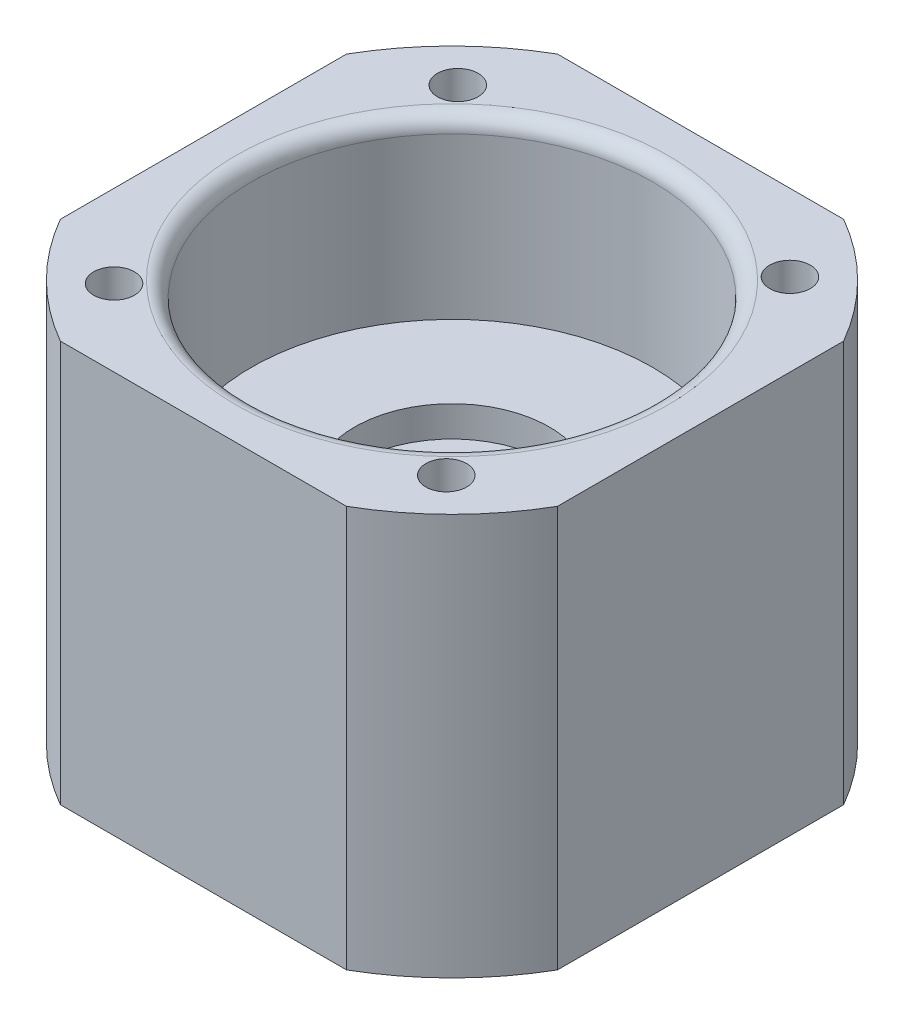
ISO-10303-21;
HEADER;
FILE_DESCRIPTION(('STEP AP214'),'2;1');
FILE_NAME('part.step','',(''),(''),'','','');
FILE_SCHEMA(('AUTOMOTIVE_DESIGN { 1 0 10303 214 1 1 1 1 }'));
ENDSEC;
DATA;
#1=APPLICATION_CONTEXT('core data for automotive mechanical design processes');
#2=APPLICATION_PROTOCOL_DEFINITION('international standard','automotive_design',2000,#1);
#3=PRODUCT_CONTEXT('',#1,'mechanical');
#4=PRODUCT('Part','Part','',(#3));
#5=PRODUCT_RELATED_PRODUCT_CATEGORY('part','',(#4));
#6=PRODUCT_DEFINITION_FORMATION('','',#4);
#7=PRODUCT_DEFINITION_CONTEXT('part definition',#1,'design');
#8=PRODUCT_DEFINITION('design','',#6,#7);
#9=PRODUCT_DEFINITION_SHAPE('','',#8);
#10=(LENGTH_UNIT() NAMED_UNIT(*) SI_UNIT(.MILLI.,.METRE.));
#11=(NAMED_UNIT(*) PLANE_ANGLE_UNIT() SI_UNIT($,.RADIAN.));
#12=(NAMED_UNIT(*) SI_UNIT($,.STERADIAN.) SOLID_ANGLE_UNIT());
#13=UNCERTAINTY_MEASURE_WITH_UNIT(LENGTH_MEASURE(1.E-05),#10,'distance_accuracy_value','');
#14=(GEOMETRIC_REPRESENTATION_CONTEXT(3) GLOBAL_UNCERTAINTY_ASSIGNED_CONTEXT((#13)) GLOBAL_UNIT_ASSIGNED_CONTEXT((#10,
#11,#12)) REPRESENTATION_CONTEXT('',''));
#15=CARTESIAN_POINT('',(0.,0.,0.));
#16=DIRECTION('',(0.,0.,1.));
#17=DIRECTION('',(1.,0.,0.));
#18=AXIS2_PLACEMENT_3D('',#15,#16,#17);
#19=CARTESIAN_POINT('',(-13.335,26.67,0.));
#20=DIRECTION('',(0.,1.,0.));
#21=DIRECTION('',(0.,0.,1.));
#22=AXIS2_PLACEMENT_3D('',#19,#20,#21);
#23=PLANE('',#22);
#24=CARTESIAN_POINT('',(0.,26.67,0.));
#25=DIRECTION('',(0.,1.,0.));
#26=DIRECTION('',(0.,0.,1.));
#27=AXIS2_PLACEMENT_3D('',#24,#25,#26);
#28=CIRCLE('',#27,14.351);
#29=CARTESIAN_POINT('',(0.,26.67,14.351));
#30=VERTEX_POINT('',#29);
#31=EDGE_CURVE('E12',#30,#30,#28,.F.);
#32=ORIENTED_EDGE('',*,*,#31,.T.);
#33=EDGE_LOOP('',(#32));
#34=FACE_BOUND('',#33,.T.);
#35=CARTESIAN_POINT('',(11.0325672343683,26.67,-11.414818667817));
#36=DIRECTION('',(0.,1.,0.));
#37=DIRECTION('',(0.,0.,1.));
#38=AXIS2_PLACEMENT_3D('',#35,#36,#37);
#39=CIRCLE('',#38,1.35254999999999);
#40=CARTESIAN_POINT('',(11.0325672343683,26.67,-10.062268667817));
#41=VERTEX_POINT('',#40);
#42=EDGE_CURVE('E226',#41,#41,#39,.T.);
#43=ORIENTED_EDGE('',*,*,#42,.F.);
#44=EDGE_LOOP('',(#43));
#45=FACE_BOUND('',#44,.T.);
#46=CARTESIAN_POINT('',(11.0325672343683,26.67,11.414818667817));
#47=DIRECTION('',(0.,1.,0.));
#48=DIRECTION('',(0.,0.,1.));
#49=AXIS2_PLACEMENT_3D('',#46,#47,#48);
#50=CIRCLE('',#49,1.35254999999999);
#51=CARTESIAN_POINT('',(11.0325672343683,26.67,12.767368667817));
#52=VERTEX_POINT('',#51);
#53=EDGE_CURVE('E225',#52,#52,#50,.T.);
#54=ORIENTED_EDGE('',*,*,#53,.F.);
#55=EDGE_LOOP('',(#54));
#56=FACE_BOUND('',#55,.T.);
#57=CARTESIAN_POINT('',(-11.0325672343683,26.67,11.414818667817));
#58=DIRECTION('',(0.,1.,0.));
#59=DIRECTION('',(0.,0.,1.));
#60=AXIS2_PLACEMENT_3D('',#57,#58,#59);
#61=CIRCLE('',#60,1.35254999999999);
#62=CARTESIAN_POINT('',(-11.0325672343683,26.67,12.767368667817));
#63=VERTEX_POINT('',#62);
#64=EDGE_CURVE('E216',#63,#63,#61,.T.);
#65=ORIENTED_EDGE('',*,*,#64,.F.);
#66=EDGE_LOOP('',(#65));
#67=FACE_BOUND('',#66,.T.);
#68=CARTESIAN_POINT('',(-11.0325672343683,26.67,-11.414818667817));
#69=DIRECTION('',(0.,1.,0.));
#70=DIRECTION('',(0.,0.,1.));
#71=AXIS2_PLACEMENT_3D('',#68,#69,#70);
#72=CIRCLE('',#71,1.35254999999999);
#73=CARTESIAN_POINT('',(-11.0325672343683,26.67,-10.062268667817));
#74=VERTEX_POINT('',#73);
#75=EDGE_CURVE('E209',#74,#74,#72,.T.);
#76=ORIENTED_EDGE('',*,*,#75,.F.);
#77=EDGE_LOOP('',(#76));
#78=FACE_BOUND('',#77,.T.);
#79=CARTESIAN_POINT('',(0.,26.67,0.));
#80=DIRECTION('',(0.,1.,0.));
#81=DIRECTION('',(0.,0.,1.));
#82=AXIS2_PLACEMENT_3D('',#79,#80,#81);
#83=CIRCLE('',#82,19.05);
#84=CARTESIAN_POINT('',(16.51,26.67,-9.50380976240582));
#85=VERTEX_POINT('',#84);
#86=CARTESIAN_POINT('',(9.50380976240582,26.67,-16.51));
#87=VERTEX_POINT('',#86);
#88=EDGE_CURVE('E107',#85,#87,#83,.T.);
#89=ORIENTED_EDGE('',*,*,#88,.T.);
#90=DIRECTION('',(1.,0.,0.));
#91=VECTOR('',#90,1.);
#92=CARTESIAN_POINT('',(-13.335,26.67,-16.51));
#93=LINE('',#92,#91);
#94=CARTESIAN_POINT('',(-9.50380976240582,26.67,-16.51));
#95=VERTEX_POINT('',#94);
#96=EDGE_CURVE('E87',#87,#95,#93,.F.);
#97=ORIENTED_EDGE('',*,*,#96,.T.);
#98=CARTESIAN_POINT('',(-16.51,26.67,-9.50380976240582));
#99=VERTEX_POINT('',#98);
#100=EDGE_CURVE('E113',#95,#99,#83,.T.);
#101=ORIENTED_EDGE('',*,*,#100,.T.);
#102=DIRECTION('',(0.,0.,1.));
#103=VECTOR('',#102,1.);
#104=CARTESIAN_POINT('',(-16.51,26.67,0.));
#105=LINE('',#104,#103);
#106=CARTESIAN_POINT('',(-16.51,26.67,9.50380976240582));
#107=VERTEX_POINT('',#106);
#108=EDGE_CURVE('E99',#99,#107,#105,.T.);
#109=ORIENTED_EDGE('',*,*,#108,.T.);
#110=CARTESIAN_POINT('',(-9.50380976240582,26.67,16.51));
#111=VERTEX_POINT('',#110);
#112=EDGE_CURVE('E116',#107,#111,#83,.T.);
#113=ORIENTED_EDGE('',*,*,#112,.T.);
#114=DIRECTION('',(1.,0.,0.));
#115=VECTOR('',#114,1.);
#116=CARTESIAN_POINT('',(-13.335,26.67,16.51));
#117=LINE('',#116,#115);
#118=CARTESIAN_POINT('',(9.50380976240582,26.67,16.51));
#119=VERTEX_POINT('',#118);
#120=EDGE_CURVE('E65',#111,#119,#117,.T.);
#121=ORIENTED_EDGE('',*,*,#120,.T.);
#122=CARTESIAN_POINT('',(16.51,26.67,9.50380976240582));
#123=VERTEX_POINT('',#122);
#124=EDGE_CURVE('E111',#119,#123,#83,.T.);
#125=ORIENTED_EDGE('',*,*,#124,.T.);
#126=DIRECTION('',(0.,0.,1.));
#127=VECTOR('',#126,1.);
#128=CARTESIAN_POINT('',(16.51,26.67,0.));
#129=LINE('',#128,#127);
#130=EDGE_CURVE('E101',#123,#85,#129,.F.);
#131=ORIENTED_EDGE('',*,*,#130,.T.);
#132=EDGE_LOOP('',(#89,#97,#101,#109,#113,#121,#125,#131));
#133=FACE_BOUND('',#132,.T.);
#134=ADVANCED_FACE('F44',(#34,#45,#56,#67,#78,#133),#23,.T.);
#135=CARTESIAN_POINT('',(0.,11.1358290356769,0.));
#136=DIRECTION('',(0.,1.,0.));
#137=DIRECTION('',(0.,0.,1.));
#138=AXIS2_PLACEMENT_3D('',#135,#136,#137);
#139=CYLINDRICAL_SURFACE('',#138,19.05);
#140=ORIENTED_EDGE('',*,*,#88,.F.);
#141=DIRECTION('',(0.,1.,0.));
#142=VECTOR('',#141,1.);
#143=CARTESIAN_POINT('',(16.51,11.1358290356769,-9.50380976240582));
#144=LINE('',#143,#142);
#145=CARTESIAN_POINT('',(16.51,0.,-9.50380976240581));
#146=VERTEX_POINT('',#145);
#147=EDGE_CURVE('E160',#85,#146,#144,.F.);
#148=ORIENTED_EDGE('',*,*,#147,.T.);
#149=CARTESIAN_POINT('',(0.,0.,0.));
#150=DIRECTION('',(0.,1.,0.));
#151=DIRECTION('',(0.,0.,1.));
#152=AXIS2_PLACEMENT_3D('',#149,#150,#151);
#153=CIRCLE('',#152,19.05);
#154=CARTESIAN_POINT('',(9.50380976240581,0.,-16.51));
#155=VERTEX_POINT('',#154);
#156=EDGE_CURVE('E109',#146,#155,#153,.T.);
#157=ORIENTED_EDGE('',*,*,#156,.T.);
#158=DIRECTION('',(0.,1.,0.));
#159=VECTOR('',#158,1.);
#160=CARTESIAN_POINT('',(9.50380976240582,11.1358290356769,-16.51));
#161=LINE('',#160,#159);
#162=EDGE_CURVE('E95',#155,#87,#161,.T.);
#163=ORIENTED_EDGE('',*,*,#162,.T.);
#164=EDGE_LOOP('',(#140,#148,#157,#163));
#165=FACE_BOUND('',#164,.T.);
#166=ADVANCED_FACE('F106',(#165),#139,.T.);
#167=CARTESIAN_POINT('',(9.50380976240581,0.,16.51));
#168=VERTEX_POINT('',#167);
#169=CARTESIAN_POINT('',(16.51,0.,9.50380976240581));
#170=VERTEX_POINT('',#169);
#171=EDGE_CURVE('E125',#168,#170,#153,.T.);
#172=ORIENTED_EDGE('',*,*,#171,.T.);
#173=DIRECTION('',(0.,1.,0.));
#174=VECTOR('',#173,1.);
#175=CARTESIAN_POINT('',(16.51,11.1358290356769,9.50380976240582));
#176=LINE('',#175,#174);
#177=EDGE_CURVE('E152',#170,#123,#176,.T.);
#178=ORIENTED_EDGE('',*,*,#177,.T.);
#179=ORIENTED_EDGE('',*,*,#124,.F.);
#180=DIRECTION('',(0.,1.,0.));
#181=VECTOR('',#180,1.);
#182=CARTESIAN_POINT('',(9.50380976240582,11.1358290356769,16.51));
#183=LINE('',#182,#181);
#184=EDGE_CURVE('E155',#119,#168,#183,.F.);
#185=ORIENTED_EDGE('',*,*,#184,.T.);
#186=EDGE_LOOP('',(#172,#178,#179,#185));
#187=FACE_BOUND('',#186,.T.);
#188=ADVANCED_FACE('F189',(#187),#139,.T.);
#189=CARTESIAN_POINT('',(-16.51,0.,9.50380976240581));
#190=VERTEX_POINT('',#189);
#191=CARTESIAN_POINT('',(-9.50380976240581,0.,16.51));
#192=VERTEX_POINT('',#191);
#193=EDGE_CURVE('E177',#190,#192,#153,.T.);
#194=ORIENTED_EDGE('',*,*,#193,.T.);
#195=DIRECTION('',(0.,1.,0.));
#196=VECTOR('',#195,1.);
#197=CARTESIAN_POINT('',(-9.50380976240582,11.1358290356769,16.51));
#198=LINE('',#197,#196);
#199=EDGE_CURVE('E147',#192,#111,#198,.T.);
#200=ORIENTED_EDGE('',*,*,#199,.T.);
#201=ORIENTED_EDGE('',*,*,#112,.F.);
#202=DIRECTION('',(0.,1.,0.));
#203=VECTOR('',#202,1.);
#204=CARTESIAN_POINT('',(-16.51,11.1358290356769,9.50380976240582));
#205=LINE('',#204,#203);
#206=EDGE_CURVE('E150',#107,#190,#205,.F.);
#207=ORIENTED_EDGE('',*,*,#206,.T.);
#208=EDGE_LOOP('',(#194,#200,#201,#207));
#209=FACE_BOUND('',#208,.T.);
#210=ADVANCED_FACE('F307',(#209),#139,.T.);
#211=CARTESIAN_POINT('',(-9.50380976240581,0.,-16.51));
#212=VERTEX_POINT('',#211);
#213=CARTESIAN_POINT('',(-16.51,0.,-9.50380976240581));
#214=VERTEX_POINT('',#213);
#215=EDGE_CURVE('E185',#212,#214,#153,.T.);
#216=ORIENTED_EDGE('',*,*,#215,.T.);
#217=DIRECTION('',(0.,1.,0.));
#218=VECTOR('',#217,1.);
#219=CARTESIAN_POINT('',(-16.51,11.1358290356769,-9.50380976240582));
#220=LINE('',#219,#218);
#221=EDGE_CURVE('E145',#214,#99,#220,.T.);
#222=ORIENTED_EDGE('',*,*,#221,.T.);
#223=ORIENTED_EDGE('',*,*,#100,.F.);
#224=DIRECTION('',(0.,1.,0.));
#225=VECTOR('',#224,1.);
#226=CARTESIAN_POINT('',(-9.50380976240582,11.1358290356769,-16.51));
#227=LINE('',#226,#225);
#228=EDGE_CURVE('E92',#95,#212,#227,.F.);
#229=ORIENTED_EDGE('',*,*,#228,.T.);
#230=EDGE_LOOP('',(#216,#222,#223,#229));
#231=FACE_BOUND('',#230,.T.);
#232=ADVANCED_FACE('F305',(#231),#139,.T.);
#233=CARTESIAN_POINT('',(-19.05,0.,0.));
#234=DIRECTION('',(0.,-1.,0.));
#235=DIRECTION('',(0.,0.,-1.));
#236=AXIS2_PLACEMENT_3D('',#233,#234,#235);
#237=PLANE('',#236);
#238=DIRECTION('',(1.,0.,0.));
#239=VECTOR('',#238,1.);
#240=CARTESIAN_POINT('',(-16.51,0.,16.51));
#241=LINE('',#240,#239);
#242=EDGE_CURVE('E129',#192,#168,#241,.T.);
#243=ORIENTED_EDGE('',*,*,#242,.F.);
#244=ORIENTED_EDGE('',*,*,#193,.F.);
#245=DIRECTION('',(0.,0.,1.));
#246=VECTOR('',#245,1.);
#247=CARTESIAN_POINT('',(-16.51,0.,16.51));
#248=LINE('',#247,#246);
#249=EDGE_CURVE('E120',#214,#190,#248,.T.);
#250=ORIENTED_EDGE('',*,*,#249,.F.);
#251=ORIENTED_EDGE('',*,*,#215,.F.);
#252=DIRECTION('',(-1.,0.,0.));
#253=VECTOR('',#252,1.);
#254=CARTESIAN_POINT('',(-16.51,0.,-16.51));
#255=LINE('',#254,#253);
#256=EDGE_CURVE('E139',#155,#212,#255,.T.);
#257=ORIENTED_EDGE('',*,*,#256,.F.);
#258=ORIENTED_EDGE('',*,*,#156,.F.);
#259=DIRECTION('',(0.,0.,-1.));
#260=VECTOR('',#259,1.);
#261=CARTESIAN_POINT('',(16.51,0.,16.51));
#262=LINE('',#261,#260);
#263=EDGE_CURVE('E131',#170,#146,#262,.T.);
#264=ORIENTED_EDGE('',*,*,#263,.F.);
#265=ORIENTED_EDGE('',*,*,#171,.F.);
#266=EDGE_LOOP('',(#243,#244,#250,#251,#257,#258,#264,#265));
#267=FACE_BOUND('',#266,.T.);
#268=CARTESIAN_POINT('',(0.,0.,0.));
#269=DIRECTION('',(0.,1.,0.));
#270=DIRECTION('',(0.,0.,1.));
#271=AXIS2_PLACEMENT_3D('',#268,#269,#270);
#272=CIRCLE('',#271,4.445);
#273=CARTESIAN_POINT('',(0.,0.,4.445));
#274=VERTEX_POINT('',#273);
#275=EDGE_CURVE('E176',#274,#274,#272,.T.);
#276=ORIENTED_EDGE('',*,*,#275,.T.);
#277=EDGE_LOOP('',(#276));
#278=FACE_BOUND('',#277,.T.);
#279=ADVANCED_FACE('F193',(#267,#278),#237,.T.);
#280=CARTESIAN_POINT('',(0.,11.1358290356769,0.));
#281=DIRECTION('',(0.,1.,0.));
#282=DIRECTION('',(0.,0.,1.));
#283=AXIS2_PLACEMENT_3D('',#280,#281,#282);
#284=CYLINDRICAL_SURFACE('',#283,4.445);
#285=CARTESIAN_POINT('',(0.,3.302,0.));
#286=DIRECTION('',(0.,1.,0.));
#287=DIRECTION('',(0.,0.,1.));
#288=AXIS2_PLACEMENT_3D('',#285,#286,#287);
#289=CIRCLE('',#288,4.445);
#290=CARTESIAN_POINT('',(0.,3.302,4.445));
#291=VERTEX_POINT('',#290);
#292=EDGE_CURVE('E174',#291,#291,#289,.T.);
#293=ORIENTED_EDGE('',*,*,#292,.T.);
#294=EDGE_LOOP('',(#293));
#295=FACE_BOUND('',#294,.T.);
#296=ORIENTED_EDGE('',*,*,#275,.F.);
#297=EDGE_LOOP('',(#296));
#298=FACE_BOUND('',#297,.T.);
#299=ADVANCED_FACE('F293',(#295,#298),#284,.F.);
#300=CARTESIAN_POINT('',(-4.445,3.302,0.));
#301=DIRECTION('',(0.,-1.,0.));
#302=DIRECTION('',(0.,0.,-1.));
#303=AXIS2_PLACEMENT_3D('',#300,#301,#302);
#304=PLANE('',#303);
#305=CARTESIAN_POINT('',(0.,3.302,0.));
#306=DIRECTION('',(0.,1.,0.));
#307=DIRECTION('',(0.,0.,1.));
#308=AXIS2_PLACEMENT_3D('',#305,#306,#307);
#309=CIRCLE('',#308,2.794);
#310=CARTESIAN_POINT('',(0.,3.302,2.794));
#311=VERTEX_POINT('',#310);
#312=EDGE_CURVE('E173',#311,#311,#309,.T.);
#313=ORIENTED_EDGE('',*,*,#312,.T.);
#314=EDGE_LOOP('',(#313));
#315=FACE_BOUND('',#314,.T.);
#316=ORIENTED_EDGE('',*,*,#292,.F.);
#317=EDGE_LOOP('',(#316));
#318=FACE_BOUND('',#317,.T.);
#319=ADVANCED_FACE('F292',(#315,#318),#304,.T.);
#320=CARTESIAN_POINT('',(0.,11.1358290356769,0.));
#321=DIRECTION('',(0.,1.,0.));
#322=DIRECTION('',(0.,0.,1.));
#323=AXIS2_PLACEMENT_3D('',#320,#321,#322);
#324=CYLINDRICAL_SURFACE('',#323,2.794);
#325=CARTESIAN_POINT('',(0.,12.954,0.));
#326=DIRECTION('',(0.,1.,0.));
#327=DIRECTION('',(0.,0.,1.));
#328=AXIS2_PLACEMENT_3D('',#325,#326,#327);
#329=CIRCLE('',#328,2.794);
#330=CARTESIAN_POINT('',(0.,12.954,2.794));
#331=VERTEX_POINT('',#330);
#332=EDGE_CURVE('E169',#331,#331,#329,.T.);
#333=ORIENTED_EDGE('',*,*,#332,.T.);
#334=EDGE_LOOP('',(#333));
#335=FACE_BOUND('',#334,.T.);
#336=ORIENTED_EDGE('',*,*,#312,.F.);
#337=EDGE_LOOP('',(#336));
#338=FACE_BOUND('',#337,.T.);
#339=ADVANCED_FACE('F290',(#335,#338),#324,.F.);
#340=CARTESIAN_POINT('',(-2.794,12.954,0.));
#341=DIRECTION('',(0.,1.,0.));
#342=DIRECTION('',(0.,0.,1.));
#343=AXIS2_PLACEMENT_3D('',#340,#341,#342);
#344=PLANE('',#343);
#345=CARTESIAN_POINT('',(0.,12.954,0.));
#346=DIRECTION('',(0.,1.,0.));
#347=DIRECTION('',(0.,0.,1.));
#348=AXIS2_PLACEMENT_3D('',#345,#346,#347);
#349=CIRCLE('',#348,6.477);
#350=CARTESIAN_POINT('',(0.,12.954,6.477));
#351=VERTEX_POINT('',#350);
#352=EDGE_CURVE('E164',#351,#351,#349,.T.);
#353=ORIENTED_EDGE('',*,*,#352,.T.);
#354=EDGE_LOOP('',(#353));
#355=FACE_BOUND('',#354,.T.);
#356=ORIENTED_EDGE('',*,*,#332,.F.);
#357=EDGE_LOOP('',(#356));
#358=FACE_BOUND('',#357,.T.);
#359=ADVANCED_FACE('F281',(#355,#358),#344,.T.);
#360=CARTESIAN_POINT('',(0.,11.1358290356769,0.));
#361=DIRECTION('',(0.,1.,0.));
#362=DIRECTION('',(0.,0.,1.));
#363=AXIS2_PLACEMENT_3D('',#360,#361,#362);
#364=CYLINDRICAL_SURFACE('',#363,6.477);
#365=CARTESIAN_POINT('',(0.,14.986,0.));
#366=DIRECTION('',(0.,1.,0.));
#367=DIRECTION('',(0.,0.,1.));
#368=AXIS2_PLACEMENT_3D('',#365,#366,#367);
#369=CIRCLE('',#368,6.477);
#370=CARTESIAN_POINT('',(0.,14.986,6.477));
#371=VERTEX_POINT('',#370);
#372=EDGE_CURVE('E165',#371,#371,#369,.T.);
#373=ORIENTED_EDGE('',*,*,#372,.T.);
#374=EDGE_LOOP('',(#373));
#375=FACE_BOUND('',#374,.T.);
#376=ORIENTED_EDGE('',*,*,#352,.F.);
#377=EDGE_LOOP('',(#376));
#378=FACE_BOUND('',#377,.T.);
#379=ADVANCED_FACE('F276',(#375,#378),#364,.F.);
#380=CARTESIAN_POINT('',(-6.477,14.986,0.));
#381=DIRECTION('',(0.,1.,0.));
#382=DIRECTION('',(0.,0.,1.));
#383=AXIS2_PLACEMENT_3D('',#380,#381,#382);
#384=PLANE('',#383);
#385=CARTESIAN_POINT('',(0.,14.986,0.));
#386=DIRECTION('',(0.,1.,0.));
#387=DIRECTION('',(0.,0.,1.));
#388=AXIS2_PLACEMENT_3D('',#385,#386,#387);
#389=CIRCLE('',#388,13.335);
#390=CARTESIAN_POINT('',(0.,14.986,13.335));
#391=VERTEX_POINT('',#390);
#392=EDGE_CURVE('E157',#391,#391,#389,.T.);
#393=ORIENTED_EDGE('',*,*,#392,.T.);
#394=EDGE_LOOP('',(#393));
#395=FACE_BOUND('',#394,.T.);
#396=ORIENTED_EDGE('',*,*,#372,.F.);
#397=EDGE_LOOP('',(#396));
#398=FACE_BOUND('',#397,.T.);
#399=ADVANCED_FACE('F277',(#395,#398),#384,.T.);
#400=CARTESIAN_POINT('',(0.,11.1358290356769,0.));
#401=DIRECTION('',(0.,1.,0.));
#402=DIRECTION('',(0.,0.,1.));
#403=AXIS2_PLACEMENT_3D('',#400,#401,#402);
#404=CYLINDRICAL_SURFACE('',#403,13.335);
#405=CARTESIAN_POINT('',(0.,25.654,0.));
#406=DIRECTION('',(0.,1.,0.));
#407=DIRECTION('',(0.,0.,1.));
#408=AXIS2_PLACEMENT_3D('',#405,#406,#407);
#409=CIRCLE('',#408,13.335);
#410=CARTESIAN_POINT('',(0.,25.654,13.335));
#411=VERTEX_POINT('',#410);
#412=EDGE_CURVE('E53',#411,#411,#409,.T.);
#413=ORIENTED_EDGE('',*,*,#412,.T.);
#414=EDGE_LOOP('',(#413));
#415=FACE_BOUND('',#414,.T.);
#416=ORIENTED_EDGE('',*,*,#392,.F.);
#417=EDGE_LOOP('',(#416));
#418=FACE_BOUND('',#417,.T.);
#419=ADVANCED_FACE('F271',(#415,#418),#404,.F.);
#420=CARTESIAN_POINT('',(-16.51,0.,-16.51));
#421=DIRECTION('',(0.,0.,-1.));
#422=DIRECTION('',(-1.,0.,0.));
#423=AXIS2_PLACEMENT_3D('',#420,#421,#422);
#424=PLANE('',#423);
#425=ORIENTED_EDGE('',*,*,#96,.F.);
#426=ORIENTED_EDGE('',*,*,#162,.F.);
#427=ORIENTED_EDGE('',*,*,#256,.T.);
#428=ORIENTED_EDGE('',*,*,#228,.F.);
#429=EDGE_LOOP('',(#425,#426,#427,#428));
#430=FACE_BOUND('',#429,.T.);
#431=ADVANCED_FACE('F90',(#430),#424,.T.);
#432=CARTESIAN_POINT('',(-16.51,0.,16.51));
#433=DIRECTION('',(-1.,0.,0.));
#434=DIRECTION('',(0.,0.,1.));
#435=AXIS2_PLACEMENT_3D('',#432,#433,#434);
#436=PLANE('',#435);
#437=ORIENTED_EDGE('',*,*,#108,.F.);
#438=ORIENTED_EDGE('',*,*,#221,.F.);
#439=ORIENTED_EDGE('',*,*,#249,.T.);
#440=ORIENTED_EDGE('',*,*,#206,.F.);
#441=EDGE_LOOP('',(#437,#438,#439,#440));
#442=FACE_BOUND('',#441,.T.);
#443=ADVANCED_FACE('F264',(#442),#436,.T.);
#444=CARTESIAN_POINT('',(-16.51,0.,16.51));
#445=DIRECTION('',(0.,0.,1.));
#446=DIRECTION('',(1.,0.,0.));
#447=AXIS2_PLACEMENT_3D('',#444,#445,#446);
#448=PLANE('',#447);
#449=ORIENTED_EDGE('',*,*,#120,.F.);
#450=ORIENTED_EDGE('',*,*,#199,.F.);
#451=ORIENTED_EDGE('',*,*,#242,.T.);
#452=ORIENTED_EDGE('',*,*,#184,.F.);
#453=EDGE_LOOP('',(#449,#450,#451,#452));
#454=FACE_BOUND('',#453,.T.);
#455=ADVANCED_FACE('F265',(#454),#448,.T.);
#456=CARTESIAN_POINT('',(16.51,0.,16.51));
#457=DIRECTION('',(1.,0.,0.));
#458=DIRECTION('',(0.,0.,-1.));
#459=AXIS2_PLACEMENT_3D('',#456,#457,#458);
#460=PLANE('',#459);
#461=ORIENTED_EDGE('',*,*,#130,.F.);
#462=ORIENTED_EDGE('',*,*,#177,.F.);
#463=ORIENTED_EDGE('',*,*,#263,.T.);
#464=ORIENTED_EDGE('',*,*,#147,.F.);
#465=EDGE_LOOP('',(#461,#462,#463,#464));
#466=FACE_BOUND('',#465,.T.);
#467=ADVANCED_FACE('F203',(#466),#460,.T.);
#468=CARTESIAN_POINT('',(-11.0325672343683,17.272,-11.414818667817));
#469=DIRECTION('',(0.,1.,0.));
#470=DIRECTION('',(0.,0.,1.));
#471=AXIS2_PLACEMENT_3D('',#468,#469,#470);
#472=CONICAL_SURFACE('',#471,1.35254999999999,1.02974425867665);
#473=CARTESIAN_POINT('',(-11.0325672343683,16.4593059697343,-11.414818667817));
#474=VERTEX_POINT('',#473);
#475=VERTEX_LOOP('',#474);
#476=FACE_BOUND('',#475,.T.);
#477=CARTESIAN_POINT('',(-11.0325672343683,17.272,-11.414818667817));
#478=DIRECTION('',(0.,1.,0.));
#479=DIRECTION('',(0.,0.,1.));
#480=AXIS2_PLACEMENT_3D('',#477,#478,#479);
#481=CIRCLE('',#480,1.35254999999999);
#482=CARTESIAN_POINT('',(-11.0325672343683,17.272,-10.062268667817));
#483=VERTEX_POINT('',#482);
#484=EDGE_CURVE('E130',#483,#483,#481,.T.);
#485=ORIENTED_EDGE('',*,*,#484,.T.);
#486=EDGE_LOOP('',(#485));
#487=FACE_BOUND('',#486,.T.);
#488=ADVANCED_FACE('F247',(#476,#487),#472,.F.);
#489=CARTESIAN_POINT('',(-11.0325672343683,26.67,-11.414818667817));
#490=DIRECTION('',(0.,1.,0.));
#491=DIRECTION('',(0.,0.,1.));
#492=AXIS2_PLACEMENT_3D('',#489,#490,#491);
#493=CYLINDRICAL_SURFACE('',#492,1.35254999999999);
#494=ORIENTED_EDGE('',*,*,#484,.F.);
#495=EDGE_LOOP('',(#494));
#496=FACE_BOUND('',#495,.T.);
#497=ORIENTED_EDGE('',*,*,#75,.T.);
#498=EDGE_LOOP('',(#497));
#499=FACE_BOUND('',#498,.T.);
#500=ADVANCED_FACE('F241',(#496,#499),#493,.F.);
#501=CARTESIAN_POINT('',(-11.0325672343683,17.272,11.414818667817));
#502=DIRECTION('',(0.,1.,0.));
#503=DIRECTION('',(0.,0.,1.));
#504=AXIS2_PLACEMENT_3D('',#501,#502,#503);
#505=CONICAL_SURFACE('',#504,1.35254999999999,1.02974425867665);
#506=CARTESIAN_POINT('',(-11.0325672343683,16.4593059697343,11.414818667817));
#507=VERTEX_POINT('',#506);
#508=VERTEX_LOOP('',#507);
#509=FACE_BOUND('',#508,.T.);
#510=CARTESIAN_POINT('',(-11.0325672343683,17.272,11.414818667817));
#511=DIRECTION('',(0.,1.,0.));
#512=DIRECTION('',(0.,0.,1.));
#513=AXIS2_PLACEMENT_3D('',#510,#511,#512);
#514=CIRCLE('',#513,1.35254999999999);
#515=CARTESIAN_POINT('',(-11.0325672343683,17.272,12.767368667817));
#516=VERTEX_POINT('',#515);
#517=EDGE_CURVE('E213',#516,#516,#514,.T.);
#518=ORIENTED_EDGE('',*,*,#517,.T.);
#519=EDGE_LOOP('',(#518));
#520=FACE_BOUND('',#519,.T.);
#521=ADVANCED_FACE('F242',(#509,#520),#505,.F.);
#522=CARTESIAN_POINT('',(-11.0325672343683,26.67,11.414818667817));
#523=DIRECTION('',(0.,1.,0.));
#524=DIRECTION('',(0.,0.,1.));
#525=AXIS2_PLACEMENT_3D('',#522,#523,#524);
#526=CYLINDRICAL_SURFACE('',#525,1.35254999999999);
#527=ORIENTED_EDGE('',*,*,#517,.F.);
#528=EDGE_LOOP('',(#527));
#529=FACE_BOUND('',#528,.T.);
#530=ORIENTED_EDGE('',*,*,#64,.T.);
#531=EDGE_LOOP('',(#530));
#532=FACE_BOUND('',#531,.T.);
#533=ADVANCED_FACE('F251',(#529,#532),#526,.F.);
#534=CARTESIAN_POINT('',(11.0325672343683,17.272,11.414818667817));
#535=DIRECTION('',(0.,1.,0.));
#536=DIRECTION('',(0.,0.,1.));
#537=AXIS2_PLACEMENT_3D('',#534,#535,#536);
#538=CONICAL_SURFACE('',#537,1.35254999999999,1.02974425867665);
#539=CARTESIAN_POINT('',(11.0325672343683,16.4593059697343,11.414818667817));
#540=VERTEX_POINT('',#539);
#541=VERTEX_LOOP('',#540);
#542=FACE_BOUND('',#541,.T.);
#543=CARTESIAN_POINT('',(11.0325672343683,17.272,11.414818667817));
#544=DIRECTION('',(0.,1.,0.));
#545=DIRECTION('',(0.,0.,1.));
#546=AXIS2_PLACEMENT_3D('',#543,#544,#545);
#547=CIRCLE('',#546,1.35254999999999);
#548=CARTESIAN_POINT('',(11.0325672343683,17.272,12.767368667817));
#549=VERTEX_POINT('',#548);
#550=EDGE_CURVE('E218',#549,#549,#547,.T.);
#551=ORIENTED_EDGE('',*,*,#550,.T.);
#552=EDGE_LOOP('',(#551));
#553=FACE_BOUND('',#552,.T.);
#554=ADVANCED_FACE('F350',(#542,#553),#538,.F.);
#555=CARTESIAN_POINT('',(11.0325672343683,26.67,11.414818667817));
#556=DIRECTION('',(0.,1.,0.));
#557=DIRECTION('',(0.,0.,1.));
#558=AXIS2_PLACEMENT_3D('',#555,#556,#557);
#559=CYLINDRICAL_SURFACE('',#558,1.35254999999999);
#560=ORIENTED_EDGE('',*,*,#550,.F.);
#561=EDGE_LOOP('',(#560));
#562=FACE_BOUND('',#561,.T.);
#563=ORIENTED_EDGE('',*,*,#53,.T.);
#564=EDGE_LOOP('',(#563));
#565=FACE_BOUND('',#564,.T.);
#566=ADVANCED_FACE('F331',(#562,#565),#559,.F.);
#567=CARTESIAN_POINT('',(11.0325672343683,17.272,-11.414818667817));
#568=DIRECTION('',(0.,1.,0.));
#569=DIRECTION('',(0.,0.,1.));
#570=AXIS2_PLACEMENT_3D('',#567,#568,#569);
#571=CONICAL_SURFACE('',#570,1.35254999999999,1.02974425867665);
#572=CARTESIAN_POINT('',(11.0325672343683,16.4593059697343,-11.414818667817));
#573=VERTEX_POINT('',#572);
#574=VERTEX_LOOP('',#573);
#575=FACE_BOUND('',#574,.T.);
#576=CARTESIAN_POINT('',(11.0325672343683,17.272,-11.414818667817));
#577=DIRECTION('',(0.,1.,0.));
#578=DIRECTION('',(0.,0.,1.));
#579=AXIS2_PLACEMENT_3D('',#576,#577,#578);
#580=CIRCLE('',#579,1.35254999999999);
#581=CARTESIAN_POINT('',(11.0325672343683,17.272,-10.062268667817));
#582=VERTEX_POINT('',#581);
#583=EDGE_CURVE('E223',#582,#582,#580,.T.);
#584=ORIENTED_EDGE('',*,*,#583,.T.);
#585=EDGE_LOOP('',(#584));
#586=FACE_BOUND('',#585,.T.);
#587=ADVANCED_FACE('F332',(#575,#586),#571,.F.);
#588=CARTESIAN_POINT('',(11.0325672343683,26.67,-11.414818667817));
#589=DIRECTION('',(0.,1.,0.));
#590=DIRECTION('',(0.,0.,1.));
#591=AXIS2_PLACEMENT_3D('',#588,#589,#590);
#592=CYLINDRICAL_SURFACE('',#591,1.35254999999999);
#593=ORIENTED_EDGE('',*,*,#583,.F.);
#594=EDGE_LOOP('',(#593));
#595=FACE_BOUND('',#594,.T.);
#596=ORIENTED_EDGE('',*,*,#42,.T.);
#597=EDGE_LOOP('',(#596));
#598=FACE_BOUND('',#597,.T.);
#599=ADVANCED_FACE('F235',(#595,#598),#592,.F.);
#600=CARTESIAN_POINT('',(0.,25.654,0.));
#601=DIRECTION('',(0.,1.,0.));
#602=DIRECTION('',(0.,0.,1.));
#603=AXIS2_PLACEMENT_3D('',#600,#601,#602);
#604=TOROIDAL_SURFACE('',#603,14.351,1.016);
#605=ORIENTED_EDGE('',*,*,#31,.F.);
#606=EDGE_LOOP('',(#605));
#607=FACE_BOUND('',#606,.T.);
#608=ORIENTED_EDGE('',*,*,#412,.F.);
#609=EDGE_LOOP('',(#608));
#610=FACE_BOUND('',#609,.T.);
#611=ADVANCED_FACE('F50',(#607,#610),#604,.T.);
#612=CLOSED_SHELL('',(#134,#166,#188,#210,#232,#279,#299,#319,#339,#359,#379,#399,#419,#431,
#443,#455,#467,#488,#500,#521,#533,#554,#566,#587,#599,#611));
#613=MANIFOLD_SOLID_BREP('B2',#612);
#614=ADVANCED_BREP_SHAPE_REPRESENTATION('',(#18,#613),#14);
#615=SHAPE_DEFINITION_REPRESENTATION(#9,#614);
ENDSEC;
END-ISO-10303-21;
